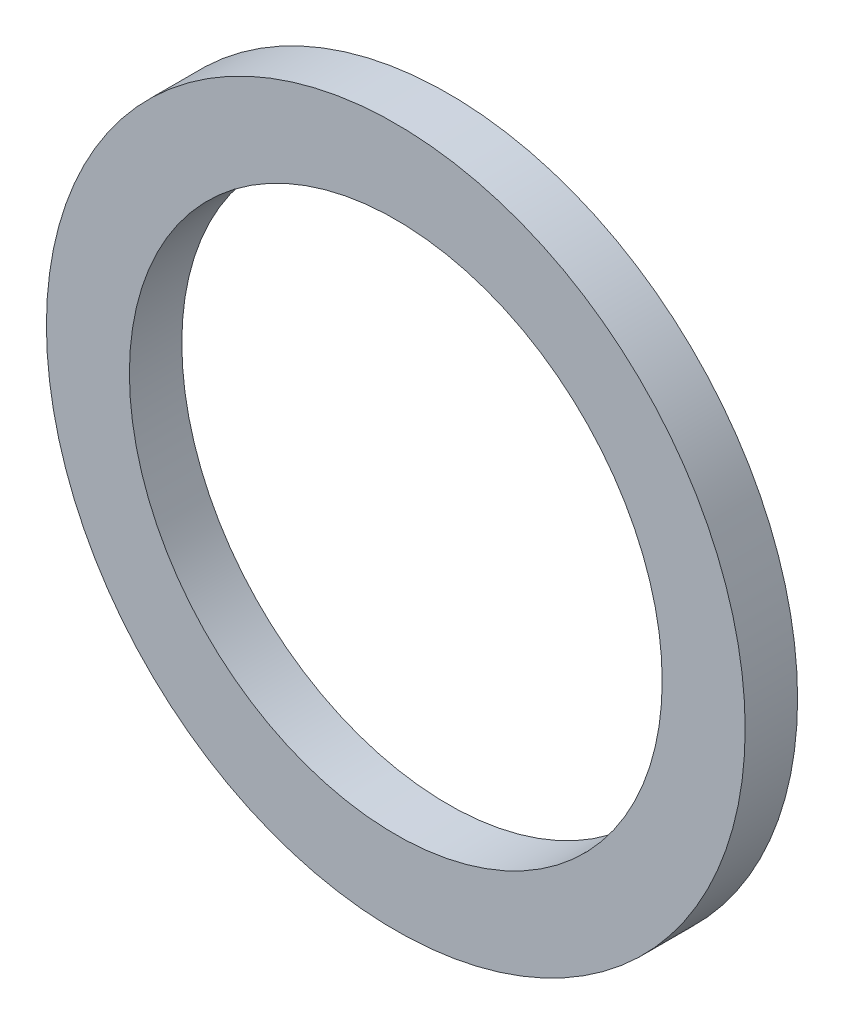
ISO-10303-21;
HEADER;
FILE_DESCRIPTION(('STEP AP214'),'2;1');
FILE_NAME('part.step','',(''),(''),'','','');
FILE_SCHEMA(('AUTOMOTIVE_DESIGN { 1 0 10303 214 1 1 1 1 }'));
ENDSEC;
DATA;
#1=APPLICATION_CONTEXT('core data for automotive mechanical design processes');
#2=APPLICATION_PROTOCOL_DEFINITION('international standard','automotive_design',2000,#1);
#3=PRODUCT_CONTEXT('',#1,'mechanical');
#4=PRODUCT('Part','Part','',(#3));
#5=PRODUCT_RELATED_PRODUCT_CATEGORY('part','',(#4));
#6=PRODUCT_DEFINITION_FORMATION('','',#4);
#7=PRODUCT_DEFINITION_CONTEXT('part definition',#1,'design');
#8=PRODUCT_DEFINITION('design','',#6,#7);
#9=PRODUCT_DEFINITION_SHAPE('','',#8);
#10=(LENGTH_UNIT() NAMED_UNIT(*) SI_UNIT(.MILLI.,.METRE.));
#11=(NAMED_UNIT(*) PLANE_ANGLE_UNIT() SI_UNIT($,.RADIAN.));
#12=(NAMED_UNIT(*) SI_UNIT($,.STERADIAN.) SOLID_ANGLE_UNIT());
#13=UNCERTAINTY_MEASURE_WITH_UNIT(LENGTH_MEASURE(1.E-05),#10,'distance_accuracy_value','');
#14=(GEOMETRIC_REPRESENTATION_CONTEXT(3) GLOBAL_UNCERTAINTY_ASSIGNED_CONTEXT((#13)) GLOBAL_UNIT_ASSIGNED_CONTEXT((#10,
#11,#12)) REPRESENTATION_CONTEXT('',''));
#15=CARTESIAN_POINT('',(0.,0.,0.));
#16=DIRECTION('',(0.,0.,1.));
#17=DIRECTION('',(1.,0.,0.));
#18=AXIS2_PLACEMENT_3D('',#15,#16,#17);
#19=CARTESIAN_POINT('',(0.,0.,1.8));
#20=DIRECTION('',(0.,0.,1.));
#21=DIRECTION('',(1.,0.,0.));
#22=AXIS2_PLACEMENT_3D('',#19,#20,#21);
#23=PLANE('',#22);
#24=CARTESIAN_POINT('',(0.,0.,1.8));
#25=DIRECTION('',(0.,0.,1.));
#26=DIRECTION('',(1.,0.,0.));
#27=AXIS2_PLACEMENT_3D('',#24,#25,#26);
#28=CIRCLE('',#27,2.);
#29=CARTESIAN_POINT('',(2.,0.,1.8));
#30=VERTEX_POINT('',#29);
#31=EDGE_CURVE('E10',#30,#30,#28,.T.);
#32=ORIENTED_EDGE('',*,*,#31,.T.);
#33=EDGE_LOOP('',(#32));
#34=FACE_BOUND('',#33,.T.);
#35=CARTESIAN_POINT('',(0.,0.,1.8));
#36=DIRECTION('',(0.,0.,1.));
#37=DIRECTION('',(1.,0.,0.));
#38=AXIS2_PLACEMENT_3D('',#35,#36,#37);
#39=CIRCLE('',#38,1.525);
#40=CARTESIAN_POINT('',(1.525,0.,1.8));
#41=VERTEX_POINT('',#40);
#42=EDGE_CURVE('E52',#41,#41,#39,.T.);
#43=ORIENTED_EDGE('',*,*,#42,.F.);
#44=EDGE_LOOP('',(#43));
#45=FACE_BOUND('',#44,.T.);
#46=ADVANCED_FACE('F39',(#34,#45),#23,.T.);
#47=CARTESIAN_POINT('',(0.,0.,1.5));
#48=DIRECTION('',(0.,0.,1.));
#49=DIRECTION('',(1.,0.,0.));
#50=AXIS2_PLACEMENT_3D('',#47,#48,#49);
#51=PLANE('',#50);
#52=CARTESIAN_POINT('',(0.,0.,1.5));
#53=DIRECTION('',(0.,0.,1.));
#54=DIRECTION('',(1.,0.,0.));
#55=AXIS2_PLACEMENT_3D('',#52,#53,#54);
#56=CIRCLE('',#55,2.);
#57=CARTESIAN_POINT('',(2.,0.,1.5));
#58=VERTEX_POINT('',#57);
#59=EDGE_CURVE('E43',#58,#58,#56,.T.);
#60=ORIENTED_EDGE('',*,*,#59,.F.);
#61=EDGE_LOOP('',(#60));
#62=FACE_BOUND('',#61,.T.);
#63=CARTESIAN_POINT('',(0.,0.,1.5));
#64=DIRECTION('',(0.,0.,1.));
#65=DIRECTION('',(1.,0.,0.));
#66=AXIS2_PLACEMENT_3D('',#63,#64,#65);
#67=CIRCLE('',#66,1.525);
#68=CARTESIAN_POINT('',(1.525,0.,1.5));
#69=VERTEX_POINT('',#68);
#70=EDGE_CURVE('E54',#69,#69,#67,.T.);
#71=ORIENTED_EDGE('',*,*,#70,.T.);
#72=EDGE_LOOP('',(#71));
#73=FACE_BOUND('',#72,.T.);
#74=ADVANCED_FACE('F70',(#62,#73),#51,.F.);
#75=CARTESIAN_POINT('',(0.,0.,1.8));
#76=DIRECTION('',(0.,0.,-1.));
#77=DIRECTION('',(-1.,0.,0.));
#78=AXIS2_PLACEMENT_3D('',#75,#76,#77);
#79=CYLINDRICAL_SURFACE('',#78,2.);
#80=ORIENTED_EDGE('',*,*,#31,.F.);
#81=EDGE_LOOP('',(#80));
#82=FACE_BOUND('',#81,.T.);
#83=ORIENTED_EDGE('',*,*,#59,.T.);
#84=EDGE_LOOP('',(#83));
#85=FACE_BOUND('',#84,.T.);
#86=ADVANCED_FACE('F41',(#82,#85),#79,.T.);
#87=CARTESIAN_POINT('',(0.,0.,1.8));
#88=DIRECTION('',(0.,0.,-1.));
#89=DIRECTION('',(-1.,0.,0.));
#90=AXIS2_PLACEMENT_3D('',#87,#88,#89);
#91=CYLINDRICAL_SURFACE('',#90,1.525);
#92=ORIENTED_EDGE('',*,*,#42,.T.);
#93=EDGE_LOOP('',(#92));
#94=FACE_BOUND('',#93,.T.);
#95=ORIENTED_EDGE('',*,*,#70,.F.);
#96=EDGE_LOOP('',(#95));
#97=FACE_BOUND('',#96,.T.);
#98=ADVANCED_FACE('F61',(#94,#97),#91,.F.);
#99=CLOSED_SHELL('',(#46,#74,#86,#98));
#100=MANIFOLD_SOLID_BREP('B2',#99);
#101=ADVANCED_BREP_SHAPE_REPRESENTATION('',(#18,#100),#14);
#102=SHAPE_DEFINITION_REPRESENTATION(#9,#101);
ENDSEC;
END-ISO-10303-21;
